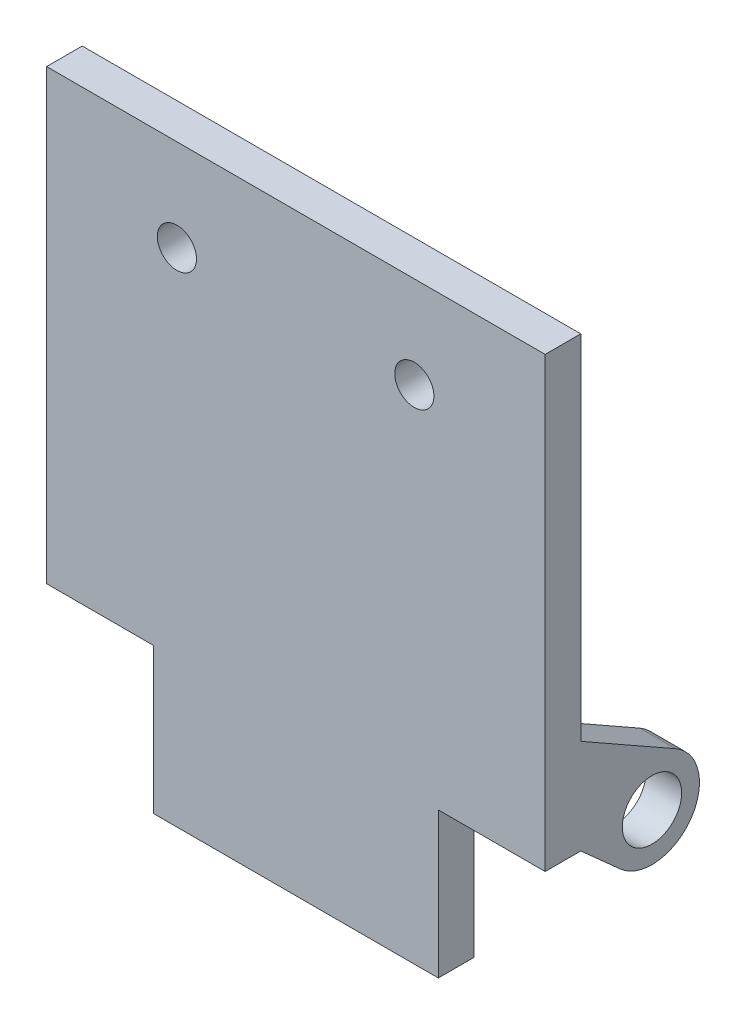
ISO-10303-21;
HEADER;
FILE_DESCRIPTION(('STEP AP214'),'2;1');
FILE_NAME('part.step','',(''),(''),'','','');
FILE_SCHEMA(('AUTOMOTIVE_DESIGN { 1 0 10303 214 1 1 1 1 }'));
ENDSEC;
DATA;
#1=APPLICATION_CONTEXT('core data for automotive mechanical design processes');
#2=APPLICATION_PROTOCOL_DEFINITION('international standard','automotive_design',2000,#1);
#3=PRODUCT_CONTEXT('',#1,'mechanical');
#4=PRODUCT('Part','Part','',(#3));
#5=PRODUCT_RELATED_PRODUCT_CATEGORY('part','',(#4));
#6=PRODUCT_DEFINITION_FORMATION('','',#4);
#7=PRODUCT_DEFINITION_CONTEXT('part definition',#1,'design');
#8=PRODUCT_DEFINITION('design','',#6,#7);
#9=PRODUCT_DEFINITION_SHAPE('','',#8);
#10=(LENGTH_UNIT() NAMED_UNIT(*) SI_UNIT(.MILLI.,.METRE.));
#11=(NAMED_UNIT(*) PLANE_ANGLE_UNIT() SI_UNIT($,.RADIAN.));
#12=(NAMED_UNIT(*) SI_UNIT($,.STERADIAN.) SOLID_ANGLE_UNIT());
#13=UNCERTAINTY_MEASURE_WITH_UNIT(LENGTH_MEASURE(1.E-05),#10,'distance_accuracy_value','');
#14=(GEOMETRIC_REPRESENTATION_CONTEXT(3) GLOBAL_UNCERTAINTY_ASSIGNED_CONTEXT((#13)) GLOBAL_UNIT_ASSIGNED_CONTEXT((#10,
#11,#12)) REPRESENTATION_CONTEXT('',''));
#15=CARTESIAN_POINT('',(0.,0.,0.));
#16=DIRECTION('',(0.,0.,1.));
#17=DIRECTION('',(1.,0.,0.));
#18=AXIS2_PLACEMENT_3D('',#15,#16,#17);
#19=CARTESIAN_POINT('',(0.,-22.,-9.));
#20=DIRECTION('',(1.,0.,0.));
#21=DIRECTION('',(0.,0.,-1.));
#22=AXIS2_PLACEMENT_3D('',#19,#20,#21);
#23=CYLINDRICAL_SURFACE('',#22,3.);
#24=DIRECTION('',(-1.,0.,0.));
#25=VECTOR('',#24,1.);
#26=CARTESIAN_POINT('',(0.,-22.,-12.));
#27=LINE('',#26,#25);
#28=CARTESIAN_POINT('',(-2.,-22.,-12.));
#29=VERTEX_POINT('',#28);
#30=CARTESIAN_POINT('',(-5.,-22.,-12.));
#31=VERTEX_POINT('',#30);
#32=EDGE_CURVE('E279',#29,#31,#27,.T.);
#33=ORIENTED_EDGE('',*,*,#32,.F.);
#34=CARTESIAN_POINT('',(-2.,-22.,-9.));
#35=DIRECTION('',(-1.,0.,0.));
#36=DIRECTION('',(0.,0.,1.));
#37=AXIS2_PLACEMENT_3D('',#34,#35,#36);
#38=CIRCLE('',#37,3.);
#39=CARTESIAN_POINT('',(-2.,-25.,-9.));
#40=VERTEX_POINT('',#39);
#41=EDGE_CURVE('E46',#40,#29,#38,.F.);
#42=ORIENTED_EDGE('',*,*,#41,.F.);
#43=DIRECTION('',(-1.,0.,0.));
#44=VECTOR('',#43,1.);
#45=CARTESIAN_POINT('',(0.,-25.,-9.));
#46=LINE('',#45,#44);
#47=CARTESIAN_POINT('',(-5.,-25.,-9.));
#48=VERTEX_POINT('',#47);
#49=EDGE_CURVE('E282',#48,#40,#46,.F.);
#50=ORIENTED_EDGE('',*,*,#49,.F.);
#51=CARTESIAN_POINT('',(-5.,-22.,-9.));
#52=DIRECTION('',(1.,0.,0.));
#53=DIRECTION('',(0.,0.,-1.));
#54=AXIS2_PLACEMENT_3D('',#51,#52,#53);
#55=CIRCLE('',#54,3.);
#56=EDGE_CURVE('E11',#31,#48,#55,.F.);
#57=ORIENTED_EDGE('',*,*,#56,.F.);
#58=EDGE_LOOP('',(#33,#42,#50,#57));
#59=FACE_BOUND('',#58,.T.);
#60=ADVANCED_FACE('F39',(#59),#23,.T.);
#61=CARTESIAN_POINT('',(3.,-25.,-5.));
#62=DIRECTION('',(0.,1.,0.));
#63=DIRECTION('',(0.,0.,1.));
#64=AXIS2_PLACEMENT_3D('',#61,#62,#63);
#65=CYLINDRICAL_SURFACE('',#64,5.);
#66=DIRECTION('',(0.,-1.,0.));
#67=VECTOR('',#66,1.);
#68=CARTESIAN_POINT('',(-2.,-25.,-5.));
#69=LINE('',#68,#67);
#70=CARTESIAN_POINT('',(-2.00000000000001,-22.3213273555428,-5.));
#71=VERTEX_POINT('',#70);
#72=CARTESIAN_POINT('',(-2.,-25.,-5.));
#73=VERTEX_POINT('',#72);
#74=EDGE_CURVE('E260',#71,#73,#69,.T.);
#75=ORIENTED_EDGE('',*,*,#74,.F.);
#76=CARTESIAN_POINT('',(-2.,-22.3213273555428,-5.));
#77=CARTESIAN_POINT('',(-1.99999865585259,-22.2943329322178,-4.99084010306282));
#78=CARTESIAN_POINT('',(-1.99997491273948,-22.2669598406963,-4.98283974000465));
#79=CARTESIAN_POINT('',(-1.99991009282106,-22.2116319119546,-4.96920322745092));
#80=CARTESIAN_POINT('',(-1.99986901655374,-22.1836770928155,-4.96356700458812));
#81=CARTESIAN_POINT('',(-1.99976297078285,-22.100758774533,-4.95051671034814));
#82=CARTESIAN_POINT('',(-1.99971208677647,-22.0452280026263,-4.94645296537758));
#83=CARTESIAN_POINT('',(-1.99972610145055,-21.9376170385381,-4.94755422390843));
#84=CARTESIAN_POINT('',(-1.9997842605876,-21.8855290151298,-4.95218206351612));
#85=CARTESIAN_POINT('',(-1.99991037932591,-21.7813705812722,-4.9696876815776));
#86=CARTESIAN_POINT('',(-1.99997855354375,-21.7293354875285,-4.98277579106642));
#87=CARTESIAN_POINT('',(-2.,-21.6786726444572,-5.));
#88=B_SPLINE_CURVE_WITH_KNOTS('',3,(#76,#77,#78,#79,#80,#81,#82,#83,#84,#85,#86,#87),
.UNSPECIFIED.,.F.,.F.,(4,2,2,2,2,4),(0.,0.0854646806368067,0.170926708820562,0.337122472356156,
0.493383210814905,0.653686460042212),.UNSPECIFIED.);
#89=CARTESIAN_POINT('',(-2.00000000000001,-21.6786726444572,-5.));
#90=VERTEX_POINT('',#89);
#91=EDGE_CURVE('E429',#71,#90,#88,.T.);
#92=ORIENTED_EDGE('',*,*,#91,.T.);
#93=CARTESIAN_POINT('',(-2.,-20.,-5.));
#94=VERTEX_POINT('',#93);
#95=EDGE_CURVE('E261',#94,#90,#69,.T.);
#96=ORIENTED_EDGE('',*,*,#95,.F.);
#97=CARTESIAN_POINT('',(3.,-20.,-5.));
#98=DIRECTION('',(0.,-1.,0.));
#99=DIRECTION('',(0.,0.,-1.));
#100=AXIS2_PLACEMENT_3D('',#97,#98,#99);
#101=CIRCLE('',#100,5.);
#102=CARTESIAN_POINT('',(3.,-20.,0.));
#103=VERTEX_POINT('',#102);
#104=EDGE_CURVE('E267',#94,#103,#101,.F.);
#105=ORIENTED_EDGE('',*,*,#104,.T.);
#106=DIRECTION('',(0.,-1.,0.));
#107=VECTOR('',#106,1.);
#108=CARTESIAN_POINT('',(3.,-25.,0.));
#109=LINE('',#108,#107);
#110=CARTESIAN_POINT('',(2.99999999999999,-25.,0.));
#111=VERTEX_POINT('',#110);
#112=EDGE_CURVE('E264',#111,#103,#109,.F.);
#113=ORIENTED_EDGE('',*,*,#112,.F.);
#114=CARTESIAN_POINT('',(3.,-25.,-5.));
#115=DIRECTION('',(0.,1.,0.));
#116=DIRECTION('',(0.,0.,1.));
#117=AXIS2_PLACEMENT_3D('',#114,#115,#116);
#118=CIRCLE('',#117,5.);
#119=EDGE_CURVE('E270',#111,#73,#118,.F.);
#120=ORIENTED_EDGE('',*,*,#119,.T.);
#121=EDGE_LOOP('',(#75,#92,#96,#105,#113,#120));
#122=FACE_BOUND('',#121,.T.);
#123=ADVANCED_FACE('F439',(#122),#65,.F.);
#124=CARTESIAN_POINT('',(3.,3.,-5.));
#125=DIRECTION('',(0.,1.,0.));
#126=DIRECTION('',(0.,0.,1.));
#127=AXIS2_PLACEMENT_3D('',#124,#125,#126);
#128=CYLINDRICAL_SURFACE('',#127,5.);
#129=DIRECTION('',(0.,-1.,0.));
#130=VECTOR('',#129,1.);
#131=CARTESIAN_POINT('',(-2.,3.,-5.));
#132=LINE('',#131,#130);
#133=CARTESIAN_POINT('',(-2.00000000000001,4.67867264445724,-5.));
#134=VERTEX_POINT('',#133);
#135=CARTESIAN_POINT('',(-2.,3.,-5.));
#136=VERTEX_POINT('',#135);
#137=EDGE_CURVE('E247',#134,#136,#132,.T.);
#138=ORIENTED_EDGE('',*,*,#137,.F.);
#139=CARTESIAN_POINT('',(-2.,4.67867264445724,-5.));
#140=CARTESIAN_POINT('',(-1.99999865585259,4.70566706778223,-4.99084010306282));
#141=CARTESIAN_POINT('',(-1.99997491273948,4.7330401593037,-4.98283974000465));
#142=CARTESIAN_POINT('',(-1.99991009282106,4.78836808804543,-4.96920322745092));
#143=CARTESIAN_POINT('',(-1.99986901655374,4.81632290718446,-4.96356700458812));
#144=CARTESIAN_POINT('',(-1.99976297078285,4.89924122546695,-4.95051671034814));
#145=CARTESIAN_POINT('',(-1.99971208677647,4.95477199737372,-4.94645296537758));
#146=CARTESIAN_POINT('',(-1.99972610145055,5.06238296146194,-4.94755422390843));
#147=CARTESIAN_POINT('',(-1.9997842605876,5.11447098487021,-4.95218206351612));
#148=CARTESIAN_POINT('',(-1.99991037932591,5.21862941872778,-4.9696876815776));
#149=CARTESIAN_POINT('',(-1.99997855354375,5.27066451247151,-4.98277579106642));
#150=CARTESIAN_POINT('',(-2.,5.32132735554276,-5.));
#151=B_SPLINE_CURVE_WITH_KNOTS('',3,(#139,#140,#141,#142,#143,#144,#145,#146,#147,#148,#149,
#150),.UNSPECIFIED.,.F.,.F.,(4,2,2,2,2,4),(0.,0.0854646806368086,0.170926708820562,
0.337122472356154,0.493383210814903,0.653686460042209),.UNSPECIFIED.);
#152=CARTESIAN_POINT('',(-2.00000000000001,5.32132735554276,-5.));
#153=VERTEX_POINT('',#152);
#154=EDGE_CURVE('E400',#134,#153,#151,.T.);
#155=ORIENTED_EDGE('',*,*,#154,.T.);
#156=CARTESIAN_POINT('',(-2.,13.,-5.));
#157=VERTEX_POINT('',#156);
#158=EDGE_CURVE('E248',#157,#153,#132,.T.);
#159=ORIENTED_EDGE('',*,*,#158,.F.);
#160=CARTESIAN_POINT('',(3.,13.,-5.));
#161=DIRECTION('',(0.,-1.,0.));
#162=DIRECTION('',(0.,0.,-1.));
#163=AXIS2_PLACEMENT_3D('',#160,#161,#162);
#164=CIRCLE('',#163,5.);
#165=CARTESIAN_POINT('',(3.,13.,0.));
#166=VERTEX_POINT('',#165);
#167=EDGE_CURVE('E254',#157,#166,#164,.F.);
#168=ORIENTED_EDGE('',*,*,#167,.T.);
#169=DIRECTION('',(0.,-1.,0.));
#170=VECTOR('',#169,1.);
#171=CARTESIAN_POINT('',(3.,3.,0.));
#172=LINE('',#171,#170);
#173=CARTESIAN_POINT('',(3.,3.,0.));
#174=VERTEX_POINT('',#173);
#175=EDGE_CURVE('E251',#174,#166,#172,.F.);
#176=ORIENTED_EDGE('',*,*,#175,.F.);
#177=CARTESIAN_POINT('',(3.,3.,-5.));
#178=DIRECTION('',(0.,1.,0.));
#179=DIRECTION('',(-1.,0.,0.));
#180=AXIS2_PLACEMENT_3D('',#177,#178,#179);
#181=CIRCLE('',#180,5.);
#182=EDGE_CURVE('E257',#174,#136,#181,.F.);
#183=ORIENTED_EDGE('',*,*,#182,.T.);
#184=EDGE_LOOP('',(#138,#155,#159,#168,#176,#183));
#185=FACE_BOUND('',#184,.T.);
#186=ADVANCED_FACE('F411',(#185),#128,.F.);
#187=CARTESIAN_POINT('',(0.,0.,0.));
#188=DIRECTION('',(0.,0.,1.));
#189=DIRECTION('',(1.,0.,0.));
#190=AXIS2_PLACEMENT_3D('',#187,#188,#189);
#191=PLANE('',#190);
#192=CARTESIAN_POINT('',(-10.0242005084872,17.2660463593125,0.));
#193=DIRECTION('',(0.,0.,1.));
#194=DIRECTION('',(1.,0.,0.));
#195=AXIS2_PLACEMENT_3D('',#192,#193,#194);
#196=CIRCLE('',#195,1.65);
#197=CARTESIAN_POINT('',(-8.37420050848724,17.2660463593125,0.));
#198=VERTEX_POINT('',#197);
#199=EDGE_CURVE('E725',#198,#198,#196,.T.);
#200=ORIENTED_EDGE('',*,*,#199,.T.);
#201=EDGE_LOOP('',(#200));
#202=FACE_BOUND('',#201,.T.);
#203=CARTESIAN_POINT('',(9.97579949151276,17.2660463593125,0.));
#204=DIRECTION('',(0.,0.,1.));
#205=DIRECTION('',(1.,0.,0.));
#206=AXIS2_PLACEMENT_3D('',#203,#204,#205);
#207=CIRCLE('',#206,1.65);
#208=CARTESIAN_POINT('',(11.6257994915128,17.2660463593125,0.));
#209=VERTEX_POINT('',#208);
#210=EDGE_CURVE('E339',#209,#209,#207,.T.);
#211=ORIENTED_EDGE('',*,*,#210,.T.);
#212=EDGE_LOOP('',(#211));
#213=FACE_BOUND('',#212,.T.);
#214=DIRECTION('',(1.,0.,0.));
#215=VECTOR('',#214,1.);
#216=CARTESIAN_POINT('',(-21.,-25.,0.));
#217=LINE('',#216,#215);
#218=CARTESIAN_POINT('',(-12.,-25.,0.));
#219=VERTEX_POINT('',#218);
#220=CARTESIAN_POINT('',(-5.00000000000001,-25.,0.));
#221=VERTEX_POINT('',#220);
#222=EDGE_CURVE('E240',#219,#221,#217,.T.);
#223=ORIENTED_EDGE('',*,*,#222,.F.);
#224=DIRECTION('',(0.,-1.,0.));
#225=VECTOR('',#224,1.);
#226=CARTESIAN_POINT('',(-12.,-25.,0.));
#227=LINE('',#226,#225);
#228=CARTESIAN_POINT('',(-12.,-12.7339536406875,0.));
#229=VERTEX_POINT('',#228);
#230=EDGE_CURVE('E210',#229,#219,#227,.T.);
#231=ORIENTED_EDGE('',*,*,#230,.F.);
#232=DIRECTION('',(1.,0.,0.));
#233=VECTOR('',#232,1.);
#234=CARTESIAN_POINT('',(-21.,-12.7339536406875,0.));
#235=LINE('',#234,#233);
#236=CARTESIAN_POINT('',(-21.,-12.7339536406875,0.));
#237=VERTEX_POINT('',#236);
#238=EDGE_CURVE('E338',#237,#229,#235,.T.);
#239=ORIENTED_EDGE('',*,*,#238,.F.);
#240=DIRECTION('',(0.,-1.,0.));
#241=VECTOR('',#240,1.);
#242=CARTESIAN_POINT('',(-21.,25.,0.));
#243=LINE('',#242,#241);
#244=CARTESIAN_POINT('',(-21.,25.,0.));
#245=VERTEX_POINT('',#244);
#246=EDGE_CURVE('E219',#245,#237,#243,.T.);
#247=ORIENTED_EDGE('',*,*,#246,.F.);
#248=DIRECTION('',(-1.,0.,0.));
#249=VECTOR('',#248,1.);
#250=CARTESIAN_POINT('',(-21.,25.,0.));
#251=LINE('',#250,#249);
#252=CARTESIAN_POINT('',(21.,25.,0.));
#253=VERTEX_POINT('',#252);
#254=EDGE_CURVE('E235',#253,#245,#251,.T.);
#255=ORIENTED_EDGE('',*,*,#254,.F.);
#256=DIRECTION('',(0.,1.,0.));
#257=VECTOR('',#256,1.);
#258=CARTESIAN_POINT('',(21.,25.,0.));
#259=LINE('',#258,#257);
#260=CARTESIAN_POINT('',(21.,-4.73395364068748,0.));
#261=VERTEX_POINT('',#260);
#262=EDGE_CURVE('E233',#261,#253,#259,.T.);
#263=ORIENTED_EDGE('',*,*,#262,.F.);
#264=DIRECTION('',(1.,0.,0.));
#265=VECTOR('',#264,1.);
#266=CARTESIAN_POINT('',(18.,-4.73395364068748,0.));
#267=LINE('',#266,#265);
#268=CARTESIAN_POINT('',(18.,-4.73395364068748,0.));
#269=VERTEX_POINT('',#268);
#270=EDGE_CURVE('E384',#269,#261,#267,.T.);
#271=ORIENTED_EDGE('',*,*,#270,.F.);
#272=DIRECTION('',(0.,-1.,0.));
#273=VECTOR('',#272,1.);
#274=CARTESIAN_POINT('',(18.,-4.73395364068748,0.));
#275=LINE('',#274,#273);
#276=CARTESIAN_POINT('',(18.,-12.7339536406875,0.));
#277=VERTEX_POINT('',#276);
#278=EDGE_CURVE('E374',#269,#277,#275,.T.);
#279=ORIENTED_EDGE('',*,*,#278,.T.);
#280=DIRECTION('',(1.,0.,0.));
#281=VECTOR('',#280,1.);
#282=CARTESIAN_POINT('',(21.,-12.7339536406875,0.));
#283=LINE('',#282,#281);
#284=CARTESIAN_POINT('',(12.,-12.7339536406875,0.));
#285=VERTEX_POINT('',#284);
#286=EDGE_CURVE('E354',#285,#277,#283,.T.);
#287=ORIENTED_EDGE('',*,*,#286,.F.);
#288=DIRECTION('',(0.,1.,0.));
#289=VECTOR('',#288,1.);
#290=CARTESIAN_POINT('',(12.,-25.,0.));
#291=LINE('',#290,#289);
#292=CARTESIAN_POINT('',(12.,-25.,0.));
#293=VERTEX_POINT('',#292);
#294=EDGE_CURVE('E350',#293,#285,#291,.T.);
#295=ORIENTED_EDGE('',*,*,#294,.F.);
#296=EDGE_CURVE('E239',#111,#293,#217,.T.);
#297=ORIENTED_EDGE('',*,*,#296,.F.);
#298=ORIENTED_EDGE('',*,*,#112,.T.);
#299=DIRECTION('',(1.,0.,0.));
#300=VECTOR('',#299,1.);
#301=CARTESIAN_POINT('',(-5.,-20.,0.));
#302=LINE('',#301,#300);
#303=CARTESIAN_POINT('',(-5.,-20.,0.));
#304=VERTEX_POINT('',#303);
#305=EDGE_CURVE('E307',#304,#103,#302,.T.);
#306=ORIENTED_EDGE('',*,*,#305,.F.);
#307=DIRECTION('',(0.,1.,0.));
#308=VECTOR('',#307,1.);
#309=CARTESIAN_POINT('',(-5.,-25.,0.));
#310=LINE('',#309,#308);
#311=EDGE_CURVE('E304',#221,#304,#310,.T.);
#312=ORIENTED_EDGE('',*,*,#311,.F.);
#313=EDGE_LOOP('',(#223,#231,#239,#247,#255,#263,#271,#279,#287,#295,#297,#298,#306,#312));
#314=FACE_BOUND('',#313,.T.);
#315=ORIENTED_EDGE('',*,*,#175,.T.);
#316=DIRECTION('',(1.,0.,0.));
#317=VECTOR('',#316,1.);
#318=CARTESIAN_POINT('',(-5.,13.,0.));
#319=LINE('',#318,#317);
#320=CARTESIAN_POINT('',(-5.,13.,0.));
#321=VERTEX_POINT('',#320);
#322=EDGE_CURVE('E702',#321,#166,#319,.T.);
#323=ORIENTED_EDGE('',*,*,#322,.F.);
#324=DIRECTION('',(0.,1.,0.));
#325=VECTOR('',#324,1.);
#326=CARTESIAN_POINT('',(-5.,3.,0.));
#327=LINE('',#326,#325);
#328=CARTESIAN_POINT('',(-5.,3.,0.));
#329=VERTEX_POINT('',#328);
#330=EDGE_CURVE('E436',#329,#321,#327,.T.);
#331=ORIENTED_EDGE('',*,*,#330,.F.);
#332=DIRECTION('',(-1.,0.,0.));
#333=VECTOR('',#332,1.);
#334=CARTESIAN_POINT('',(-5.,3.,0.));
#335=LINE('',#334,#333);
#336=EDGE_CURVE('E687',#174,#329,#335,.T.);
#337=ORIENTED_EDGE('',*,*,#336,.F.);
#338=EDGE_LOOP('',(#315,#323,#331,#337));
#339=FACE_BOUND('',#338,.T.);
#340=ADVANCED_FACE('F335',(#202,#213,#314,#339),#191,.F.);
#341=CARTESIAN_POINT('',(21.,25.,3.));
#342=DIRECTION('',(-1.,0.,0.));
#343=DIRECTION('',(0.,-1.,0.));
#344=AXIS2_PLACEMENT_3D('',#341,#342,#343);
#345=PLANE('',#344);
#346=DIRECTION('',(0.,1.,0.));
#347=VECTOR('',#346,1.);
#348=CARTESIAN_POINT('',(21.,25.,3.));
#349=LINE('',#348,#347);
#350=CARTESIAN_POINT('',(21.,-12.7339536406875,3.));
#351=VERTEX_POINT('',#350);
#352=CARTESIAN_POINT('',(21.,25.,3.));
#353=VERTEX_POINT('',#352);
#354=EDGE_CURVE('E229',#351,#353,#349,.T.);
#355=ORIENTED_EDGE('',*,*,#354,.F.);
#356=DIRECTION('',(0.,0.,-1.));
#357=VECTOR('',#356,1.);
#358=CARTESIAN_POINT('',(21.,-12.7339536406875,3.));
#359=LINE('',#358,#357);
#360=CARTESIAN_POINT('',(21.,-12.7339536406875,0.));
#361=VERTEX_POINT('',#360);
#362=EDGE_CURVE('E360',#351,#361,#359,.T.);
#363=ORIENTED_EDGE('',*,*,#362,.T.);
#364=DIRECTION('',(0.,-0.666666666666667,-0.74535599249993));
#365=VECTOR('',#364,1.);
#366=CARTESIAN_POINT('',(21.,-12.7339536406875,0.));
#367=LINE('',#366,#365);
#368=CARTESIAN_POINT('',(21.,-15.7153776106872,-3.33333333333333));
#369=VERTEX_POINT('',#368);
#370=EDGE_CURVE('E386',#361,#369,#367,.T.);
#371=ORIENTED_EDGE('',*,*,#370,.T.);
#372=CARTESIAN_POINT('',(21.,-12.7339536406875,-6.));
#373=DIRECTION('',(1.,0.,0.));
#374=DIRECTION('',(0.,1.,0.));
#375=AXIS2_PLACEMENT_3D('',#372,#373,#374);
#376=CIRCLE('',#375,4.);
#377=CARTESIAN_POINT('',(21.,-9.25431730710868,-7.97284844477174));
#378=VERTEX_POINT('',#377);
#379=EDGE_CURVE('E375',#369,#378,#376,.T.);
#380=ORIENTED_EDGE('',*,*,#379,.T.);
#381=DIRECTION('',(0.,0.493212111192935,0.869909083394701));
#382=VECTOR('',#381,1.);
#383=CARTESIAN_POINT('',(21.,-4.73395364068748,0.));
#384=LINE('',#383,#382);
#385=EDGE_CURVE('E330',#378,#261,#384,.T.);
#386=ORIENTED_EDGE('',*,*,#385,.T.);
#387=ORIENTED_EDGE('',*,*,#262,.T.);
#388=DIRECTION('',(0.,0.,-1.));
#389=VECTOR('',#388,1.);
#390=CARTESIAN_POINT('',(21.,25.,3.));
#391=LINE('',#390,#389);
#392=EDGE_CURVE('E244',#353,#253,#391,.T.);
#393=ORIENTED_EDGE('',*,*,#392,.F.);
#394=EDGE_LOOP('',(#355,#363,#371,#380,#386,#387,#393));
#395=FACE_BOUND('',#394,.T.);
#396=CARTESIAN_POINT('',(21.,-12.7339536406875,-6.));
#397=DIRECTION('',(1.,0.,0.));
#398=DIRECTION('',(0.,1.,0.));
#399=AXIS2_PLACEMENT_3D('',#396,#397,#398);
#400=CIRCLE('',#399,2.5);
#401=CARTESIAN_POINT('',(21.,-10.2339536406875,-6.));
#402=VERTEX_POINT('',#401);
#403=EDGE_CURVE('E362',#402,#402,#400,.T.);
#404=ORIENTED_EDGE('',*,*,#403,.F.);
#405=EDGE_LOOP('',(#404));
#406=FACE_BOUND('',#405,.T.);
#407=ADVANCED_FACE('F324',(#395,#406),#345,.F.);
#408=CARTESIAN_POINT('',(-21.,25.,3.));
#409=DIRECTION('',(0.,-1.,0.));
#410=DIRECTION('',(0.,0.,-1.));
#411=AXIS2_PLACEMENT_3D('',#408,#409,#410);
#412=PLANE('',#411);
#413=ORIENTED_EDGE('',*,*,#254,.T.);
#414=DIRECTION('',(0.,0.,-1.));
#415=VECTOR('',#414,1.);
#416=CARTESIAN_POINT('',(-21.,25.,3.));
#417=LINE('',#416,#415);
#418=CARTESIAN_POINT('',(-21.,25.,3.));
#419=VERTEX_POINT('',#418);
#420=EDGE_CURVE('E227',#419,#245,#417,.T.);
#421=ORIENTED_EDGE('',*,*,#420,.F.);
#422=DIRECTION('',(-1.,0.,0.));
#423=VECTOR('',#422,1.);
#424=CARTESIAN_POINT('',(-21.,25.,3.));
#425=LINE('',#424,#423);
#426=EDGE_CURVE('E223',#353,#419,#425,.T.);
#427=ORIENTED_EDGE('',*,*,#426,.F.);
#428=ORIENTED_EDGE('',*,*,#392,.T.);
#429=EDGE_LOOP('',(#413,#421,#427,#428));
#430=FACE_BOUND('',#429,.T.);
#431=ADVANCED_FACE('F323',(#430),#412,.F.);
#432=CARTESIAN_POINT('',(-21.,25.,3.));
#433=DIRECTION('',(1.,0.,0.));
#434=DIRECTION('',(0.,1.,0.));
#435=AXIS2_PLACEMENT_3D('',#432,#433,#434);
#436=PLANE('',#435);
#437=ORIENTED_EDGE('',*,*,#246,.T.);
#438=DIRECTION('',(0.,0.,-1.));
#439=VECTOR('',#438,1.);
#440=CARTESIAN_POINT('',(-21.,-12.7339536406875,3.));
#441=LINE('',#440,#439);
#442=CARTESIAN_POINT('',(-21.,-12.7339536406875,3.));
#443=VERTEX_POINT('',#442);
#444=EDGE_CURVE('E203',#443,#237,#441,.T.);
#445=ORIENTED_EDGE('',*,*,#444,.F.);
#446=DIRECTION('',(0.,-1.,0.));
#447=VECTOR('',#446,1.);
#448=CARTESIAN_POINT('',(-21.,25.,3.));
#449=LINE('',#448,#447);
#450=EDGE_CURVE('E217',#419,#443,#449,.T.);
#451=ORIENTED_EDGE('',*,*,#450,.F.);
#452=ORIENTED_EDGE('',*,*,#420,.T.);
#453=EDGE_LOOP('',(#437,#445,#451,#452));
#454=FACE_BOUND('',#453,.T.);
#455=ADVANCED_FACE('F215',(#454),#436,.F.);
#456=CARTESIAN_POINT('',(-21.,-25.,3.));
#457=DIRECTION('',(0.,1.,0.));
#458=DIRECTION('',(0.,0.,1.));
#459=AXIS2_PLACEMENT_3D('',#456,#457,#458);
#460=PLANE('',#459);
#461=DIRECTION('',(0.,0.,1.));
#462=VECTOR('',#461,1.);
#463=CARTESIAN_POINT('',(-5.,-25.,-12.));
#464=LINE('',#463,#462);
#465=EDGE_CURVE('E297',#48,#221,#464,.T.);
#466=ORIENTED_EDGE('',*,*,#465,.F.);
#467=ORIENTED_EDGE('',*,*,#49,.T.);
#468=DIRECTION('',(0.,0.,1.));
#469=VECTOR('',#468,1.);
#470=CARTESIAN_POINT('',(-2.,-25.,-12.));
#471=LINE('',#470,#469);
#472=EDGE_CURVE('E291',#40,#73,#471,.T.);
#473=ORIENTED_EDGE('',*,*,#472,.T.);
#474=ORIENTED_EDGE('',*,*,#119,.F.);
#475=ORIENTED_EDGE('',*,*,#296,.T.);
#476=DIRECTION('',(0.,0.,-1.));
#477=VECTOR('',#476,1.);
#478=CARTESIAN_POINT('',(12.,-25.,3.));
#479=LINE('',#478,#477);
#480=CARTESIAN_POINT('',(12.,-25.,3.));
#481=VERTEX_POINT('',#480);
#482=EDGE_CURVE('E356',#481,#293,#479,.T.);
#483=ORIENTED_EDGE('',*,*,#482,.F.);
#484=DIRECTION('',(1.,0.,0.));
#485=VECTOR('',#484,1.);
#486=CARTESIAN_POINT('',(-21.,-25.,3.));
#487=LINE('',#486,#485);
#488=CARTESIAN_POINT('',(-12.,-25.,3.));
#489=VERTEX_POINT('',#488);
#490=EDGE_CURVE('E225',#489,#481,#487,.T.);
#491=ORIENTED_EDGE('',*,*,#490,.F.);
#492=DIRECTION('',(0.,0.,-1.));
#493=VECTOR('',#492,1.);
#494=CARTESIAN_POINT('',(-12.,-25.,3.));
#495=LINE('',#494,#493);
#496=EDGE_CURVE('E347',#489,#219,#495,.T.);
#497=ORIENTED_EDGE('',*,*,#496,.T.);
#498=ORIENTED_EDGE('',*,*,#222,.T.);
#499=EDGE_LOOP('',(#466,#467,#473,#474,#475,#483,#491,#497,#498));
#500=FACE_BOUND('',#499,.T.);
#501=ADVANCED_FACE('F462',(#500),#460,.F.);
#502=CARTESIAN_POINT('',(0.,0.,3.));
#503=DIRECTION('',(0.,0.,1.));
#504=DIRECTION('',(1.,0.,0.));
#505=AXIS2_PLACEMENT_3D('',#502,#503,#504);
#506=PLANE('',#505);
#507=CARTESIAN_POINT('',(-10.0242005084872,17.2660463593125,3.));
#508=DIRECTION('',(0.,0.,1.));
#509=DIRECTION('',(1.,0.,0.));
#510=AXIS2_PLACEMENT_3D('',#507,#508,#509);
#511=CIRCLE('',#510,1.65);
#512=CARTESIAN_POINT('',(-8.37420050848724,17.2660463593125,3.));
#513=VERTEX_POINT('',#512);
#514=EDGE_CURVE('E722',#513,#513,#511,.T.);
#515=ORIENTED_EDGE('',*,*,#514,.F.);
#516=EDGE_LOOP('',(#515));
#517=FACE_BOUND('',#516,.T.);
#518=CARTESIAN_POINT('',(9.97579949151276,17.2660463593125,3.));
#519=DIRECTION('',(0.,0.,1.));
#520=DIRECTION('',(1.,0.,0.));
#521=AXIS2_PLACEMENT_3D('',#518,#519,#520);
#522=CIRCLE('',#521,1.65);
#523=CARTESIAN_POINT('',(11.6257994915128,17.2660463593125,3.));
#524=VERTEX_POINT('',#523);
#525=EDGE_CURVE('E343',#524,#524,#522,.T.);
#526=ORIENTED_EDGE('',*,*,#525,.F.);
#527=EDGE_LOOP('',(#526));
#528=FACE_BOUND('',#527,.T.);
#529=DIRECTION('',(0.,-1.,0.));
#530=VECTOR('',#529,1.);
#531=CARTESIAN_POINT('',(-12.,-25.,3.));
#532=LINE('',#531,#530);
#533=CARTESIAN_POINT('',(-12.,-12.7339536406875,3.));
#534=VERTEX_POINT('',#533);
#535=EDGE_CURVE('E209',#534,#489,#532,.T.);
#536=ORIENTED_EDGE('',*,*,#535,.T.);
#537=ORIENTED_EDGE('',*,*,#490,.T.);
#538=DIRECTION('',(0.,1.,0.));
#539=VECTOR('',#538,1.);
#540=CARTESIAN_POINT('',(12.,-25.,3.));
#541=LINE('',#540,#539);
#542=CARTESIAN_POINT('',(12.,-12.7339536406875,3.));
#543=VERTEX_POINT('',#542);
#544=EDGE_CURVE('E352',#481,#543,#541,.T.);
#545=ORIENTED_EDGE('',*,*,#544,.T.);
#546=DIRECTION('',(1.,0.,0.));
#547=VECTOR('',#546,1.);
#548=CARTESIAN_POINT('',(21.,-12.7339536406875,3.));
#549=LINE('',#548,#547);
#550=EDGE_CURVE('E318',#543,#351,#549,.T.);
#551=ORIENTED_EDGE('',*,*,#550,.T.);
#552=ORIENTED_EDGE('',*,*,#354,.T.);
#553=ORIENTED_EDGE('',*,*,#426,.T.);
#554=ORIENTED_EDGE('',*,*,#450,.T.);
#555=DIRECTION('',(1.,0.,0.));
#556=VECTOR('',#555,1.);
#557=CARTESIAN_POINT('',(-21.,-12.7339536406875,3.));
#558=LINE('',#557,#556);
#559=EDGE_CURVE('E199',#443,#534,#558,.T.);
#560=ORIENTED_EDGE('',*,*,#559,.T.);
#561=EDGE_LOOP('',(#536,#537,#545,#551,#552,#553,#554,#560));
#562=FACE_BOUND('',#561,.T.);
#563=ADVANCED_FACE('F221',(#517,#528,#562),#506,.T.);
#564=CARTESIAN_POINT('',(-5.,-25.,-12.));
#565=DIRECTION('',(1.,0.,0.));
#566=DIRECTION('',(0.,0.,-1.));
#567=AXIS2_PLACEMENT_3D('',#564,#565,#566);
#568=PLANE('',#567);
#569=CARTESIAN_POINT('',(-5.,-22.,-5.94696817822982));
#570=DIRECTION('',(-1.,0.,0.));
#571=DIRECTION('',(0.,0.,1.));
#572=AXIS2_PLACEMENT_3D('',#569,#570,#571);
#573=CIRCLE('',#572,1.);
#574=CARTESIAN_POINT('',(-5.,-22.,-4.94696817822982));
#575=VERTEX_POINT('',#574);
#576=EDGE_CURVE('E409',#575,#575,#573,.T.);
#577=ORIENTED_EDGE('',*,*,#576,.F.);
#578=EDGE_LOOP('',(#577));
#579=FACE_BOUND('',#578,.T.);
#580=DIRECTION('',(0.,1.,0.));
#581=VECTOR('',#580,1.);
#582=CARTESIAN_POINT('',(-5.,-25.,-12.));
#583=LINE('',#582,#581);
#584=CARTESIAN_POINT('',(-5.,-20.,-12.));
#585=VERTEX_POINT('',#584);
#586=EDGE_CURVE('E300',#31,#585,#583,.T.);
#587=ORIENTED_EDGE('',*,*,#586,.F.);
#588=ORIENTED_EDGE('',*,*,#56,.T.);
#589=ORIENTED_EDGE('',*,*,#465,.T.);
#590=ORIENTED_EDGE('',*,*,#311,.T.);
#591=DIRECTION('',(0.,0.,1.));
#592=VECTOR('',#591,1.);
#593=CARTESIAN_POINT('',(-5.,-20.,-12.));
#594=LINE('',#593,#592);
#595=EDGE_CURVE('E236',#585,#304,#594,.T.);
#596=ORIENTED_EDGE('',*,*,#595,.F.);
#597=EDGE_LOOP('',(#587,#588,#589,#590,#596));
#598=FACE_BOUND('',#597,.T.);
#599=ADVANCED_FACE('F464',(#579,#598),#568,.F.);
#600=CARTESIAN_POINT('',(-5.,-20.,-12.));
#601=DIRECTION('',(0.,-1.,0.));
#602=DIRECTION('',(0.,0.,-1.));
#603=AXIS2_PLACEMENT_3D('',#600,#601,#602);
#604=PLANE('',#603);
#605=ORIENTED_EDGE('',*,*,#305,.T.);
#606=ORIENTED_EDGE('',*,*,#104,.F.);
#607=DIRECTION('',(0.,0.,1.));
#608=VECTOR('',#607,1.);
#609=CARTESIAN_POINT('',(-2.,-20.,-12.));
#610=LINE('',#609,#608);
#611=CARTESIAN_POINT('',(-2.,-20.,-12.));
#612=VERTEX_POINT('',#611);
#613=EDGE_CURVE('E311',#612,#94,#610,.T.);
#614=ORIENTED_EDGE('',*,*,#613,.F.);
#615=DIRECTION('',(1.,0.,0.));
#616=VECTOR('',#615,1.);
#617=CARTESIAN_POINT('',(-5.,-20.,-12.));
#618=LINE('',#617,#616);
#619=EDGE_CURVE('E295',#585,#612,#618,.T.);
#620=ORIENTED_EDGE('',*,*,#619,.F.);
#621=ORIENTED_EDGE('',*,*,#595,.T.);
#622=EDGE_LOOP('',(#605,#606,#614,#620,#621));
#623=FACE_BOUND('',#622,.T.);
#624=ADVANCED_FACE('F466',(#623),#604,.F.);
#625=CARTESIAN_POINT('',(-2.,-25.,-12.));
#626=DIRECTION('',(-1.,0.,0.));
#627=DIRECTION('',(0.,0.,1.));
#628=AXIS2_PLACEMENT_3D('',#625,#626,#627);
#629=PLANE('',#628);
#630=ORIENTED_EDGE('',*,*,#472,.F.);
#631=ORIENTED_EDGE('',*,*,#41,.T.);
#632=DIRECTION('',(0.,-1.,0.));
#633=VECTOR('',#632,1.);
#634=CARTESIAN_POINT('',(-2.,-25.,-12.));
#635=LINE('',#634,#633);
#636=EDGE_CURVE('E289',#612,#29,#635,.T.);
#637=ORIENTED_EDGE('',*,*,#636,.F.);
#638=ORIENTED_EDGE('',*,*,#613,.T.);
#639=ORIENTED_EDGE('',*,*,#95,.T.);
#640=CARTESIAN_POINT('',(-2.00000000000001,-22.,-5.94696817822982));
#641=DIRECTION('',(-1.,0.,0.));
#642=DIRECTION('',(0.,0.,1.));
#643=AXIS2_PLACEMENT_3D('',#640,#641,#642);
#644=CIRCLE('',#643,1.);
#645=EDGE_CURVE('E273',#90,#71,#644,.T.);
#646=ORIENTED_EDGE('',*,*,#645,.T.);
#647=ORIENTED_EDGE('',*,*,#74,.T.);
#648=EDGE_LOOP('',(#630,#631,#637,#638,#639,#646,#647));
#649=FACE_BOUND('',#648,.T.);
#650=ADVANCED_FACE('F286',(#649),#629,.F.);
#651=CARTESIAN_POINT('',(0.,0.,-12.));
#652=DIRECTION('',(0.,0.,-1.));
#653=DIRECTION('',(-1.,0.,0.));
#654=AXIS2_PLACEMENT_3D('',#651,#652,#653);
#655=PLANE('',#654);
#656=ORIENTED_EDGE('',*,*,#636,.T.);
#657=ORIENTED_EDGE('',*,*,#32,.T.);
#658=ORIENTED_EDGE('',*,*,#586,.T.);
#659=ORIENTED_EDGE('',*,*,#619,.T.);
#660=EDGE_LOOP('',(#656,#657,#658,#659));
#661=FACE_BOUND('',#660,.T.);
#662=ADVANCED_FACE('F293',(#661),#655,.T.);
#663=CARTESIAN_POINT('',(-5.,3.,-12.));
#664=DIRECTION('',(1.,0.,0.));
#665=DIRECTION('',(0.,0.,-1.));
#666=AXIS2_PLACEMENT_3D('',#663,#664,#665);
#667=PLANE('',#666);
#668=CARTESIAN_POINT('',(-5.,5.,-5.94696817822982));
#669=DIRECTION('',(-1.,0.,0.));
#670=DIRECTION('',(0.,0.,1.));
#671=AXIS2_PLACEMENT_3D('',#668,#669,#670);
#672=CIRCLE('',#671,1.);
#673=CARTESIAN_POINT('',(-5.,5.,-4.94696817822982));
#674=VERTEX_POINT('',#673);
#675=EDGE_CURVE('E392',#674,#674,#672,.T.);
#676=ORIENTED_EDGE('',*,*,#675,.F.);
#677=EDGE_LOOP('',(#676));
#678=FACE_BOUND('',#677,.T.);
#679=ORIENTED_EDGE('',*,*,#330,.T.);
#680=DIRECTION('',(0.,0.,1.));
#681=VECTOR('',#680,1.);
#682=CARTESIAN_POINT('',(-5.,13.,-12.));
#683=LINE('',#682,#681);
#684=CARTESIAN_POINT('',(-5.,13.,-12.));
#685=VERTEX_POINT('',#684);
#686=EDGE_CURVE('E308',#685,#321,#683,.T.);
#687=ORIENTED_EDGE('',*,*,#686,.F.);
#688=DIRECTION('',(0.,1.,0.));
#689=VECTOR('',#688,1.);
#690=CARTESIAN_POINT('',(-5.,3.,-12.));
#691=LINE('',#690,#689);
#692=CARTESIAN_POINT('',(-5.,3.,-12.));
#693=VERTEX_POINT('',#692);
#694=EDGE_CURVE('E437',#693,#685,#691,.T.);
#695=ORIENTED_EDGE('',*,*,#694,.F.);
#696=DIRECTION('',(0.,0.,1.));
#697=VECTOR('',#696,1.);
#698=CARTESIAN_POINT('',(-5.,3.,-12.));
#699=LINE('',#698,#697);
#700=EDGE_CURVE('E698',#693,#329,#699,.T.);
#701=ORIENTED_EDGE('',*,*,#700,.T.);
#702=EDGE_LOOP('',(#679,#687,#695,#701));
#703=FACE_BOUND('',#702,.T.);
#704=ADVANCED_FACE('F598',(#678,#703),#667,.F.);
#705=CARTESIAN_POINT('',(-5.,13.,-12.));
#706=DIRECTION('',(0.,-1.,0.));
#707=DIRECTION('',(0.,0.,-1.));
#708=AXIS2_PLACEMENT_3D('',#705,#706,#707);
#709=PLANE('',#708);
#710=ORIENTED_EDGE('',*,*,#322,.T.);
#711=ORIENTED_EDGE('',*,*,#167,.F.);
#712=DIRECTION('',(0.,0.,1.));
#713=VECTOR('',#712,1.);
#714=CARTESIAN_POINT('',(-2.,13.,-12.));
#715=LINE('',#714,#713);
#716=CARTESIAN_POINT('',(-2.,13.,-12.));
#717=VERTEX_POINT('',#716);
#718=EDGE_CURVE('E690',#717,#157,#715,.T.);
#719=ORIENTED_EDGE('',*,*,#718,.F.);
#720=DIRECTION('',(1.,0.,0.));
#721=VECTOR('',#720,1.);
#722=CARTESIAN_POINT('',(-5.,13.,-12.));
#723=LINE('',#722,#721);
#724=EDGE_CURVE('E680',#685,#717,#723,.T.);
#725=ORIENTED_EDGE('',*,*,#724,.F.);
#726=ORIENTED_EDGE('',*,*,#686,.T.);
#727=EDGE_LOOP('',(#710,#711,#719,#725,#726));
#728=FACE_BOUND('',#727,.T.);
#729=ADVANCED_FACE('F606',(#728),#709,.F.);
#730=CARTESIAN_POINT('',(-2.,3.,-12.));
#731=DIRECTION('',(-1.,0.,0.));
#732=DIRECTION('',(0.,0.,1.));
#733=AXIS2_PLACEMENT_3D('',#730,#731,#732);
#734=PLANE('',#733);
#735=ORIENTED_EDGE('',*,*,#158,.T.);
#736=CARTESIAN_POINT('',(-2.00000000000001,5.,-5.94696817822982));
#737=DIRECTION('',(-1.,0.,0.));
#738=DIRECTION('',(0.,0.,1.));
#739=AXIS2_PLACEMENT_3D('',#736,#737,#738);
#740=CIRCLE('',#739,1.);
#741=EDGE_CURVE('E276',#153,#134,#740,.T.);
#742=ORIENTED_EDGE('',*,*,#741,.T.);
#743=ORIENTED_EDGE('',*,*,#137,.T.);
#744=DIRECTION('',(0.,0.,1.));
#745=VECTOR('',#744,1.);
#746=CARTESIAN_POINT('',(-2.,3.,-12.));
#747=LINE('',#746,#745);
#748=CARTESIAN_POINT('',(-2.,3.,-12.));
#749=VERTEX_POINT('',#748);
#750=EDGE_CURVE('E693',#749,#136,#747,.T.);
#751=ORIENTED_EDGE('',*,*,#750,.F.);
#752=DIRECTION('',(0.,-1.,0.));
#753=VECTOR('',#752,1.);
#754=CARTESIAN_POINT('',(-2.,3.,-12.));
#755=LINE('',#754,#753);
#756=EDGE_CURVE('E706',#717,#749,#755,.T.);
#757=ORIENTED_EDGE('',*,*,#756,.F.);
#758=ORIENTED_EDGE('',*,*,#718,.T.);
#759=EDGE_LOOP('',(#735,#742,#743,#751,#757,#758));
#760=FACE_BOUND('',#759,.T.);
#761=ADVANCED_FACE('F615',(#760),#734,.F.);
#762=CARTESIAN_POINT('',(-5.,3.,-12.));
#763=DIRECTION('',(0.,1.,0.));
#764=DIRECTION('',(-1.,0.,0.));
#765=AXIS2_PLACEMENT_3D('',#762,#763,#764);
#766=PLANE('',#765);
#767=ORIENTED_EDGE('',*,*,#336,.T.);
#768=ORIENTED_EDGE('',*,*,#700,.F.);
#769=DIRECTION('',(-1.,0.,0.));
#770=VECTOR('',#769,1.);
#771=CARTESIAN_POINT('',(-5.,3.,-12.));
#772=LINE('',#771,#770);
#773=EDGE_CURVE('E683',#749,#693,#772,.T.);
#774=ORIENTED_EDGE('',*,*,#773,.F.);
#775=ORIENTED_EDGE('',*,*,#750,.T.);
#776=ORIENTED_EDGE('',*,*,#182,.F.);
#777=EDGE_LOOP('',(#767,#768,#774,#775,#776));
#778=FACE_BOUND('',#777,.T.);
#779=ADVANCED_FACE('F623',(#778),#766,.F.);
#780=CARTESIAN_POINT('',(0.,0.,-12.));
#781=DIRECTION('',(0.,0.,-1.));
#782=DIRECTION('',(-1.,0.,0.));
#783=AXIS2_PLACEMENT_3D('',#780,#781,#782);
#784=PLANE('',#783);
#785=ORIENTED_EDGE('',*,*,#694,.T.);
#786=ORIENTED_EDGE('',*,*,#724,.T.);
#787=ORIENTED_EDGE('',*,*,#756,.T.);
#788=ORIENTED_EDGE('',*,*,#773,.T.);
#789=EDGE_LOOP('',(#785,#786,#787,#788));
#790=FACE_BOUND('',#789,.T.);
#791=ADVANCED_FACE('F426',(#790),#784,.T.);
#792=CARTESIAN_POINT('',(21.,-22.,-5.94696817822982));
#793=DIRECTION('',(-1.,0.,0.));
#794=DIRECTION('',(0.,0.,1.));
#795=AXIS2_PLACEMENT_3D('',#792,#793,#794);
#796=CYLINDRICAL_SURFACE('',#795,1.);
#797=ORIENTED_EDGE('',*,*,#576,.T.);
#798=EDGE_LOOP('',(#797));
#799=FACE_BOUND('',#798,.T.);
#800=ORIENTED_EDGE('',*,*,#645,.F.);
#801=ORIENTED_EDGE('',*,*,#91,.F.);
#802=EDGE_LOOP('',(#800,#801));
#803=FACE_BOUND('',#802,.T.);
#804=ADVANCED_FACE('F420',(#799,#803),#796,.F.);
#805=CARTESIAN_POINT('',(21.,5.,-5.94696817822982));
#806=DIRECTION('',(-1.,0.,0.));
#807=DIRECTION('',(0.,0.,1.));
#808=AXIS2_PLACEMENT_3D('',#805,#806,#807);
#809=CYLINDRICAL_SURFACE('',#808,1.);
#810=ORIENTED_EDGE('',*,*,#675,.T.);
#811=EDGE_LOOP('',(#810));
#812=FACE_BOUND('',#811,.T.);
#813=ORIENTED_EDGE('',*,*,#741,.F.);
#814=ORIENTED_EDGE('',*,*,#154,.F.);
#815=EDGE_LOOP('',(#813,#814));
#816=FACE_BOUND('',#815,.T.);
#817=ADVANCED_FACE('F414',(#812,#816),#809,.F.);
#818=CARTESIAN_POINT('',(18.,-4.73395364068748,0.));
#819=DIRECTION('',(0.,0.869909083394701,-0.493212111192935));
#820=DIRECTION('',(0.,0.493212111192935,0.869909083394701));
#821=AXIS2_PLACEMENT_3D('',#818,#819,#820);
#822=PLANE('',#821);
#823=ORIENTED_EDGE('',*,*,#385,.F.);
#824=DIRECTION('',(1.,0.,0.));
#825=VECTOR('',#824,1.);
#826=CARTESIAN_POINT('',(18.,-9.25431730710868,-7.97284844477174));
#827=LINE('',#826,#825);
#828=CARTESIAN_POINT('',(18.,-9.25431730710868,-7.97284844477174));
#829=VERTEX_POINT('',#828);
#830=EDGE_CURVE('E390',#829,#378,#827,.T.);
#831=ORIENTED_EDGE('',*,*,#830,.F.);
#832=DIRECTION('',(0.,0.493212111192935,0.869909083394701));
#833=VECTOR('',#832,1.);
#834=CARTESIAN_POINT('',(18.,-4.73395364068748,0.));
#835=LINE('',#834,#833);
#836=EDGE_CURVE('E371',#829,#269,#835,.T.);
#837=ORIENTED_EDGE('',*,*,#836,.T.);
#838=ORIENTED_EDGE('',*,*,#270,.T.);
#839=EDGE_LOOP('',(#823,#831,#837,#838));
#840=FACE_BOUND('',#839,.T.);
#841=ADVANCED_FACE('F419',(#840),#822,.T.);
#842=CARTESIAN_POINT('',(18.,-12.7339536406875,-6.));
#843=DIRECTION('',(1.,0.,0.));
#844=DIRECTION('',(0.,1.,0.));
#845=AXIS2_PLACEMENT_3D('',#842,#843,#844);
#846=CYLINDRICAL_SURFACE('',#845,4.);
#847=ORIENTED_EDGE('',*,*,#379,.F.);
#848=DIRECTION('',(1.,0.,0.));
#849=VECTOR('',#848,1.);
#850=CARTESIAN_POINT('',(18.,-15.7153776106872,-3.33333333333333));
#851=LINE('',#850,#849);
#852=CARTESIAN_POINT('',(18.,-15.7153776106872,-3.33333333333333));
#853=VERTEX_POINT('',#852);
#854=EDGE_CURVE('E393',#853,#369,#851,.T.);
#855=ORIENTED_EDGE('',*,*,#854,.F.);
#856=CARTESIAN_POINT('',(18.,-12.7339536406875,-6.));
#857=DIRECTION('',(1.,0.,0.));
#858=DIRECTION('',(0.,1.,0.));
#859=AXIS2_PLACEMENT_3D('',#856,#857,#858);
#860=CIRCLE('',#859,4.);
#861=EDGE_CURVE('E381',#853,#829,#860,.T.);
#862=ORIENTED_EDGE('',*,*,#861,.T.);
#863=ORIENTED_EDGE('',*,*,#830,.T.);
#864=EDGE_LOOP('',(#847,#855,#862,#863));
#865=FACE_BOUND('',#864,.T.);
#866=ADVANCED_FACE('F514',(#865),#846,.T.);
#867=CARTESIAN_POINT('',(18.,-12.7339536406875,0.));
#868=DIRECTION('',(0.,-0.74535599249993,0.666666666666667));
#869=DIRECTION('',(0.,-0.666666666666667,-0.74535599249993));
#870=AXIS2_PLACEMENT_3D('',#867,#868,#869);
#871=PLANE('',#870);
#872=ORIENTED_EDGE('',*,*,#370,.F.);
#873=DIRECTION('',(1.,0.,0.));
#874=VECTOR('',#873,1.);
#875=CARTESIAN_POINT('',(18.,-12.7339536406875,0.));
#876=LINE('',#875,#874);
#877=EDGE_CURVE('E395',#277,#361,#876,.T.);
#878=ORIENTED_EDGE('',*,*,#877,.F.);
#879=DIRECTION('',(0.,-0.666666666666667,-0.74535599249993));
#880=VECTOR('',#879,1.);
#881=CARTESIAN_POINT('',(18.,-12.7339536406875,0.));
#882=LINE('',#881,#880);
#883=EDGE_CURVE('E378',#277,#853,#882,.T.);
#884=ORIENTED_EDGE('',*,*,#883,.T.);
#885=ORIENTED_EDGE('',*,*,#854,.T.);
#886=EDGE_LOOP('',(#872,#878,#884,#885));
#887=FACE_BOUND('',#886,.T.);
#888=ADVANCED_FACE('F509',(#887),#871,.T.);
#889=CARTESIAN_POINT('',(18.,-12.7339536406875,-6.));
#890=DIRECTION('',(1.,0.,0.));
#891=DIRECTION('',(0.,1.,0.));
#892=AXIS2_PLACEMENT_3D('',#889,#890,#891);
#893=PLANE('',#892);
#894=CARTESIAN_POINT('',(18.,-12.7339536406875,-6.));
#895=DIRECTION('',(1.,0.,0.));
#896=DIRECTION('',(0.,1.,0.));
#897=AXIS2_PLACEMENT_3D('',#894,#895,#896);
#898=CIRCLE('',#897,2.5);
#899=CARTESIAN_POINT('',(18.,-10.2339536406875,-6.));
#900=VERTEX_POINT('',#899);
#901=EDGE_CURVE('E366',#900,#900,#898,.T.);
#902=ORIENTED_EDGE('',*,*,#901,.T.);
#903=EDGE_LOOP('',(#902));
#904=FACE_BOUND('',#903,.T.);
#905=ORIENTED_EDGE('',*,*,#836,.F.);
#906=ORIENTED_EDGE('',*,*,#861,.F.);
#907=ORIENTED_EDGE('',*,*,#883,.F.);
#908=ORIENTED_EDGE('',*,*,#278,.F.);
#909=EDGE_LOOP('',(#905,#906,#907,#908));
#910=FACE_BOUND('',#909,.T.);
#911=ADVANCED_FACE('F513',(#904,#910),#893,.F.);
#912=CARTESIAN_POINT('',(18.,-12.7339536406875,-6.));
#913=DIRECTION('',(1.,0.,0.));
#914=DIRECTION('',(0.,1.,0.));
#915=AXIS2_PLACEMENT_3D('',#912,#913,#914);
#916=CYLINDRICAL_SURFACE('',#915,2.5);
#917=ORIENTED_EDGE('',*,*,#901,.F.);
#918=EDGE_LOOP('',(#917));
#919=FACE_BOUND('',#918,.T.);
#920=ORIENTED_EDGE('',*,*,#403,.T.);
#921=EDGE_LOOP('',(#920));
#922=FACE_BOUND('',#921,.T.);
#923=ADVANCED_FACE('F498',(#919,#922),#916,.F.);
#924=CARTESIAN_POINT('',(21.,-12.7339536406875,3.));
#925=DIRECTION('',(0.,1.,0.));
#926=DIRECTION('',(0.,0.,1.));
#927=AXIS2_PLACEMENT_3D('',#924,#925,#926);
#928=PLANE('',#927);
#929=ORIENTED_EDGE('',*,*,#286,.T.);
#930=ORIENTED_EDGE('',*,*,#877,.T.);
#931=ORIENTED_EDGE('',*,*,#362,.F.);
#932=ORIENTED_EDGE('',*,*,#550,.F.);
#933=DIRECTION('',(0.,0.,-1.));
#934=VECTOR('',#933,1.);
#935=CARTESIAN_POINT('',(12.,-12.7339536406875,3.));
#936=LINE('',#935,#934);
#937=EDGE_CURVE('E363',#543,#285,#936,.T.);
#938=ORIENTED_EDGE('',*,*,#937,.T.);
#939=EDGE_LOOP('',(#929,#930,#931,#932,#938));
#940=FACE_BOUND('',#939,.T.);
#941=ADVANCED_FACE('F526',(#940),#928,.F.);
#942=CARTESIAN_POINT('',(12.,-25.,3.));
#943=DIRECTION('',(-1.,0.,0.));
#944=DIRECTION('',(0.,-1.,0.));
#945=AXIS2_PLACEMENT_3D('',#942,#943,#944);
#946=PLANE('',#945);
#947=ORIENTED_EDGE('',*,*,#294,.T.);
#948=ORIENTED_EDGE('',*,*,#937,.F.);
#949=ORIENTED_EDGE('',*,*,#544,.F.);
#950=ORIENTED_EDGE('',*,*,#482,.T.);
#951=EDGE_LOOP('',(#947,#948,#949,#950));
#952=FACE_BOUND('',#951,.T.);
#953=ADVANCED_FACE('F530',(#952),#946,.F.);
#954=CARTESIAN_POINT('',(-12.,-25.,3.));
#955=DIRECTION('',(1.,0.,0.));
#956=DIRECTION('',(0.,0.,-1.));
#957=AXIS2_PLACEMENT_3D('',#954,#955,#956);
#958=PLANE('',#957);
#959=ORIENTED_EDGE('',*,*,#230,.T.);
#960=ORIENTED_EDGE('',*,*,#496,.F.);
#961=ORIENTED_EDGE('',*,*,#535,.F.);
#962=DIRECTION('',(0.,0.,-1.));
#963=VECTOR('',#962,1.);
#964=CARTESIAN_POINT('',(-12.,-12.7339536406875,3.));
#965=LINE('',#964,#963);
#966=EDGE_CURVE('E205',#534,#229,#965,.T.);
#967=ORIENTED_EDGE('',*,*,#966,.T.);
#968=EDGE_LOOP('',(#959,#960,#961,#967));
#969=FACE_BOUND('',#968,.T.);
#970=ADVANCED_FACE('F538',(#969),#958,.F.);
#971=CARTESIAN_POINT('',(-21.,-12.7339536406875,3.));
#972=DIRECTION('',(0.,1.,0.));
#973=DIRECTION('',(-1.,0.,0.));
#974=AXIS2_PLACEMENT_3D('',#971,#972,#973);
#975=PLANE('',#974);
#976=ORIENTED_EDGE('',*,*,#238,.T.);
#977=ORIENTED_EDGE('',*,*,#966,.F.);
#978=ORIENTED_EDGE('',*,*,#559,.F.);
#979=ORIENTED_EDGE('',*,*,#444,.T.);
#980=EDGE_LOOP('',(#976,#977,#978,#979));
#981=FACE_BOUND('',#980,.T.);
#982=ADVANCED_FACE('F202',(#981),#975,.F.);
#983=CARTESIAN_POINT('',(9.97579949151276,17.2660463593125,-12.));
#984=DIRECTION('',(0.,0.,1.));
#985=DIRECTION('',(1.,0.,0.));
#986=AXIS2_PLACEMENT_3D('',#983,#984,#985);
#987=CYLINDRICAL_SURFACE('',#986,1.65);
#988=ORIENTED_EDGE('',*,*,#525,.T.);
#989=EDGE_LOOP('',(#988));
#990=FACE_BOUND('',#989,.T.);
#991=ORIENTED_EDGE('',*,*,#210,.F.);
#992=EDGE_LOOP('',(#991));
#993=FACE_BOUND('',#992,.T.);
#994=ADVANCED_FACE('F552',(#990,#993),#987,.F.);
#995=CARTESIAN_POINT('',(-10.0242005084872,17.2660463593125,-12.));
#996=DIRECTION('',(0.,0.,1.));
#997=DIRECTION('',(1.,0.,0.));
#998=AXIS2_PLACEMENT_3D('',#995,#996,#997);
#999=CYLINDRICAL_SURFACE('',#998,1.65);
#1000=ORIENTED_EDGE('',*,*,#514,.T.);
#1001=EDGE_LOOP('',(#1000));
#1002=FACE_BOUND('',#1001,.T.);
#1003=ORIENTED_EDGE('',*,*,#199,.F.);
#1004=EDGE_LOOP('',(#1003));
#1005=FACE_BOUND('',#1004,.T.);
#1006=ADVANCED_FACE('F569',(#1002,#1005),#999,.F.);
#1007=CLOSED_SHELL('',(#60,#123,#186,#340,#407,#431,#455,#501,#563,#599,#624,#650,#662,#704,
#729,#761,#779,#791,#804,#817,#841,#866,#888,#911,#923,#941,#953,#970,#982,#994,#1006));
#1008=MANIFOLD_SOLID_BREP('B2',#1007);
#1009=ADVANCED_BREP_SHAPE_REPRESENTATION('',(#18,#1008),#14);
#1010=SHAPE_DEFINITION_REPRESENTATION(#9,#1009);
ENDSEC;
END-ISO-10303-21;
